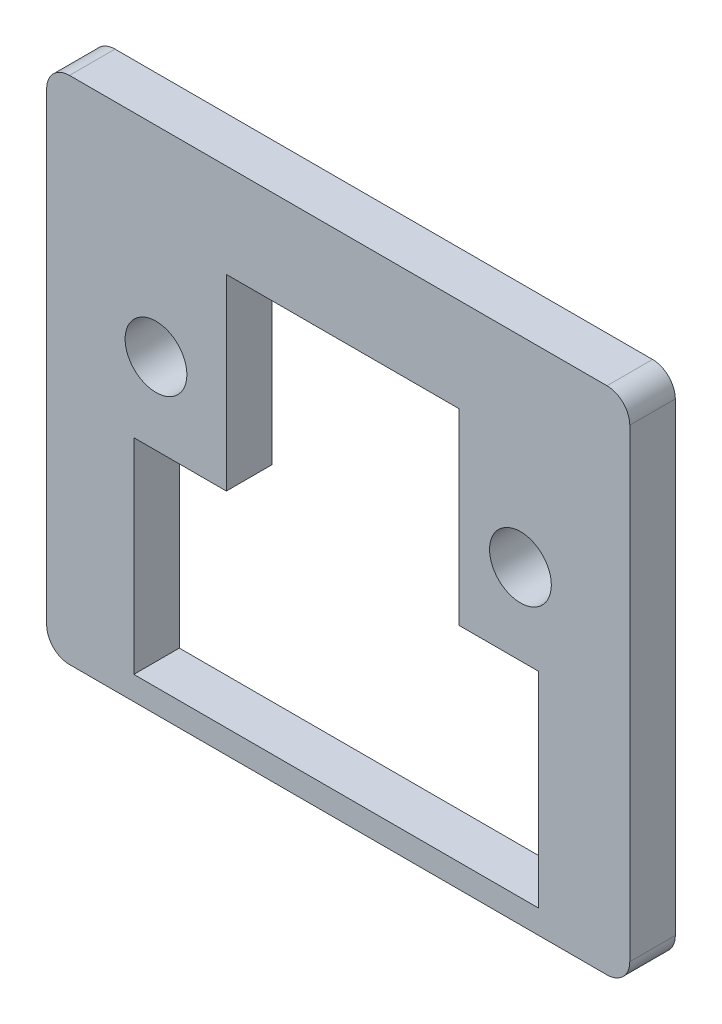
ISO-10303-21;
HEADER;
FILE_DESCRIPTION(('STEP AP214'),'2;1');
FILE_NAME('part.step','',(''),(''),'','','');
FILE_SCHEMA(('AUTOMOTIVE_DESIGN { 1 0 10303 214 1 1 1 1 }'));
ENDSEC;
DATA;
#1=APPLICATION_CONTEXT('core data for automotive mechanical design processes');
#2=APPLICATION_PROTOCOL_DEFINITION('international standard','automotive_design',2000,#1);
#3=PRODUCT_CONTEXT('',#1,'mechanical');
#4=PRODUCT('Part','Part','',(#3));
#5=PRODUCT_RELATED_PRODUCT_CATEGORY('part','',(#4));
#6=PRODUCT_DEFINITION_FORMATION('','',#4);
#7=PRODUCT_DEFINITION_CONTEXT('part definition',#1,'design');
#8=PRODUCT_DEFINITION('design','',#6,#7);
#9=PRODUCT_DEFINITION_SHAPE('','',#8);
#10=(LENGTH_UNIT() NAMED_UNIT(*) SI_UNIT(.MILLI.,.METRE.));
#11=(NAMED_UNIT(*) PLANE_ANGLE_UNIT() SI_UNIT($,.RADIAN.));
#12=(NAMED_UNIT(*) SI_UNIT($,.STERADIAN.) SOLID_ANGLE_UNIT());
#13=UNCERTAINTY_MEASURE_WITH_UNIT(LENGTH_MEASURE(1.E-05),#10,'distance_accuracy_value','');
#14=(GEOMETRIC_REPRESENTATION_CONTEXT(3) GLOBAL_UNCERTAINTY_ASSIGNED_CONTEXT((#13)) GLOBAL_UNIT_ASSIGNED_CONTEXT((#10,
#11,#12)) REPRESENTATION_CONTEXT('',''));
#15=CARTESIAN_POINT('',(0.,0.,0.));
#16=DIRECTION('',(0.,0.,1.));
#17=DIRECTION('',(1.,0.,0.));
#18=AXIS2_PLACEMENT_3D('',#15,#16,#17);
#19=CARTESIAN_POINT('',(-1.58750000000011,1.58749999999956,3.175));
#20=DIRECTION('',(0.,0.,1.));
#21=DIRECTION('',(1.,0.,0.));
#22=AXIS2_PLACEMENT_3D('',#19,#20,#21);
#23=PLANE('',#22);
#24=DIRECTION('',(0.,-1.,0.));
#25=VECTOR('',#24,1.);
#26=CARTESIAN_POINT('',(-11.9185627495797,29.0180049818764,3.175));
#27=LINE('',#26,#25);
#28=CARTESIAN_POINT('',(-11.9185627495797,29.0180049818764,3.175));
#29=VERTEX_POINT('',#28);
#30=CARTESIAN_POINT('',(-11.9185627495797,15.9394789528714,3.175));
#31=VERTEX_POINT('',#30);
#32=EDGE_CURVE('E148',#29,#31,#27,.T.);
#33=ORIENTED_EDGE('',*,*,#32,.T.);
#34=DIRECTION('',(1.,0.,0.));
#35=VECTOR('',#34,1.);
#36=CARTESIAN_POINT('',(-11.9185627495797,15.9394789528714,3.175));
#37=LINE('',#36,#35);
#38=CARTESIAN_POINT('',(-6.3753464194054,15.9394789528714,3.175));
#39=VERTEX_POINT('',#38);
#40=EDGE_CURVE('E157',#31,#39,#37,.T.);
#41=ORIENTED_EDGE('',*,*,#40,.T.);
#42=DIRECTION('',(0.,-1.,0.));
#43=VECTOR('',#42,1.);
#44=CARTESIAN_POINT('',(-6.3753464194054,15.9394789528714,3.175));
#45=LINE('',#44,#43);
#46=CARTESIAN_POINT('',(-6.3753464194054,1.64837435164083,3.175));
#47=VERTEX_POINT('',#46);
#48=EDGE_CURVE('E48',#39,#47,#45,.T.);
#49=ORIENTED_EDGE('',*,*,#48,.T.);
#50=DIRECTION('',(-1.,0.,0.));
#51=VECTOR('',#50,1.);
#52=CARTESIAN_POINT('',(-6.3753464194054,1.64837435164083,3.175));
#53=LINE('',#52,#51);
#54=CARTESIAN_POINT('',(-34.5677982236512,1.64837435164083,3.175));
#55=VERTEX_POINT('',#54);
#56=EDGE_CURVE('E170',#47,#55,#53,.T.);
#57=ORIENTED_EDGE('',*,*,#56,.T.);
#58=DIRECTION('',(0.,1.,0.));
#59=VECTOR('',#58,1.);
#60=CARTESIAN_POINT('',(-34.5677982236512,1.64837435164083,3.175));
#61=LINE('',#60,#59);
#62=CARTESIAN_POINT('',(-34.5677982236512,15.9394789528714,3.175));
#63=VERTEX_POINT('',#62);
#64=EDGE_CURVE('E173',#55,#63,#61,.T.);
#65=ORIENTED_EDGE('',*,*,#64,.T.);
#66=DIRECTION('',(1.,0.,0.));
#67=VECTOR('',#66,1.);
#68=CARTESIAN_POINT('',(-34.5677982236512,15.9394789528714,3.175));
#69=LINE('',#68,#67);
#70=CARTESIAN_POINT('',(-28.1151479643077,15.9394789528714,3.175));
#71=VERTEX_POINT('',#70);
#72=EDGE_CURVE('E176',#63,#71,#69,.T.);
#73=ORIENTED_EDGE('',*,*,#72,.T.);
#74=DIRECTION('',(0.,-1.,0.));
#75=VECTOR('',#74,1.);
#76=CARTESIAN_POINT('',(-28.1151479643077,29.0180049818764,3.175));
#77=LINE('',#76,#75);
#78=CARTESIAN_POINT('',(-28.1151479643077,29.0180049818764,3.175));
#79=VERTEX_POINT('',#78);
#80=EDGE_CURVE('E179',#79,#71,#77,.T.);
#81=ORIENTED_EDGE('',*,*,#80,.F.);
#82=DIRECTION('',(-1.,0.,0.));
#83=VECTOR('',#82,1.);
#84=CARTESIAN_POINT('',(-11.9185627495797,29.0180049818764,3.175));
#85=LINE('',#84,#83);
#86=EDGE_CURVE('E154',#29,#79,#85,.T.);
#87=ORIENTED_EDGE('',*,*,#86,.F.);
#88=EDGE_LOOP('',(#33,#41,#49,#57,#65,#73,#81,#87));
#89=FACE_BOUND('',#88,.T.);
#90=CARTESIAN_POINT('',(-7.62000000000011,21.5899999999996,3.175));
#91=DIRECTION('',(0.,0.,1.));
#92=DIRECTION('',(1.,0.,0.));
#93=AXIS2_PLACEMENT_3D('',#90,#91,#92);
#94=CIRCLE('',#93,2.15265);
#95=CARTESIAN_POINT('',(-5.46735000000011,21.5899999999996,3.175));
#96=VERTEX_POINT('',#95);
#97=EDGE_CURVE('E219',#96,#96,#94,.T.);
#98=ORIENTED_EDGE('',*,*,#97,.F.);
#99=EDGE_LOOP('',(#98));
#100=FACE_BOUND('',#99,.T.);
#101=CARTESIAN_POINT('',(-1.58750000000011,1.58749999999956,3.175));
#102=DIRECTION('',(0.,0.,1.));
#103=DIRECTION('',(1.,0.,0.));
#104=AXIS2_PLACEMENT_3D('',#101,#102,#103);
#105=CIRCLE('',#104,1.5875);
#106=CARTESIAN_POINT('',(-1.58750000000011,-4.43872369415566E-13,3.175));
#107=VERTEX_POINT('',#106);
#108=CARTESIAN_POINT('',(-1.10588621593521E-13,1.58749999999956,3.175));
#109=VERTEX_POINT('',#108);
#110=EDGE_CURVE('E225',#107,#109,#105,.T.);
#111=ORIENTED_EDGE('',*,*,#110,.T.);
#112=DIRECTION('',(0.,1.,0.));
#113=VECTOR('',#112,1.);
#114=CARTESIAN_POINT('',(-1.10588621593521E-13,1.58749999999956,3.175));
#115=LINE('',#114,#113);
#116=CARTESIAN_POINT('',(-1.15359111152458E-13,33.9724999999996,3.175));
#117=VERTEX_POINT('',#116);
#118=EDGE_CURVE('E228',#109,#117,#115,.T.);
#119=ORIENTED_EDGE('',*,*,#118,.T.);
#120=CARTESIAN_POINT('',(-1.58750000000011,33.9724999999996,3.175));
#121=DIRECTION('',(0.,0.,1.));
#122=DIRECTION('',(1.,0.,0.));
#123=AXIS2_PLACEMENT_3D('',#120,#121,#122);
#124=CIRCLE('',#123,1.5875);
#125=CARTESIAN_POINT('',(-1.58750000000011,35.5599999999996,3.175));
#126=VERTEX_POINT('',#125);
#127=EDGE_CURVE('E231',#117,#126,#124,.T.);
#128=ORIENTED_EDGE('',*,*,#127,.T.);
#129=DIRECTION('',(-1.,0.,0.));
#130=VECTOR('',#129,1.);
#131=CARTESIAN_POINT('',(-1.58750000000011,35.5599999999996,3.175));
#132=LINE('',#131,#130);
#133=CARTESIAN_POINT('',(-39.0525000000001,35.5599999999995,3.175));
#134=VERTEX_POINT('',#133);
#135=EDGE_CURVE('E233',#126,#134,#132,.T.);
#136=ORIENTED_EDGE('',*,*,#135,.T.);
#137=CARTESIAN_POINT('',(-39.0525000000001,33.9724999999995,3.175));
#138=DIRECTION('',(0.,0.,1.));
#139=DIRECTION('',(1.,0.,0.));
#140=AXIS2_PLACEMENT_3D('',#137,#138,#139);
#141=CIRCLE('',#140,1.5875);
#142=CARTESIAN_POINT('',(-40.6400000000001,33.9724999999995,3.175));
#143=VERTEX_POINT('',#142);
#144=EDGE_CURVE('E235',#134,#143,#141,.T.);
#145=ORIENTED_EDGE('',*,*,#144,.T.);
#146=DIRECTION('',(0.,-1.,0.));
#147=VECTOR('',#146,1.);
#148=CARTESIAN_POINT('',(-40.6400000000001,33.9724999999995,3.175));
#149=LINE('',#148,#147);
#150=CARTESIAN_POINT('',(-40.6400000000001,1.58749999999955,3.175));
#151=VERTEX_POINT('',#150);
#152=EDGE_CURVE('E237',#143,#151,#149,.T.);
#153=ORIENTED_EDGE('',*,*,#152,.T.);
#154=CARTESIAN_POINT('',(-39.0525000000001,1.58749999999955,3.175));
#155=DIRECTION('',(0.,0.,1.));
#156=DIRECTION('',(1.,0.,0.));
#157=AXIS2_PLACEMENT_3D('',#154,#155,#156);
#158=CIRCLE('',#157,1.5875);
#159=CARTESIAN_POINT('',(-39.0525000000001,-4.47341816367519E-13,3.175));
#160=VERTEX_POINT('',#159);
#161=EDGE_CURVE('E239',#151,#160,#158,.T.);
#162=ORIENTED_EDGE('',*,*,#161,.T.);
#163=DIRECTION('',(1.,0.,0.));
#164=VECTOR('',#163,1.);
#165=CARTESIAN_POINT('',(-39.0525000000001,-4.47341816367519E-13,3.175));
#166=LINE('',#165,#164);
#167=EDGE_CURVE('E241',#160,#107,#166,.T.);
#168=ORIENTED_EDGE('',*,*,#167,.T.);
#169=EDGE_LOOP('',(#111,#119,#128,#136,#145,#153,#162,#168));
#170=FACE_BOUND('',#169,.T.);
#171=CARTESIAN_POINT('',(-33.0200000000001,21.5899999999996,3.175));
#172=DIRECTION('',(0.,0.,1.));
#173=DIRECTION('',(1.,0.,0.));
#174=AXIS2_PLACEMENT_3D('',#171,#172,#173);
#175=CIRCLE('',#174,2.15265);
#176=CARTESIAN_POINT('',(-30.8673500000001,21.5899999999996,3.175));
#177=VERTEX_POINT('',#176);
#178=EDGE_CURVE('E213',#177,#177,#175,.T.);
#179=ORIENTED_EDGE('',*,*,#178,.F.);
#180=EDGE_LOOP('',(#179));
#181=FACE_BOUND('',#180,.T.);
#182=ADVANCED_FACE('F33',(#89,#100,#170,#181),#23,.T.);
#183=CARTESIAN_POINT('',(-1.58750000000011,1.58749999999956,0.));
#184=DIRECTION('',(0.,0.,1.));
#185=DIRECTION('',(1.,0.,0.));
#186=AXIS2_PLACEMENT_3D('',#183,#184,#185);
#187=PLANE('',#186);
#188=DIRECTION('',(1.,0.,0.));
#189=VECTOR('',#188,1.);
#190=CARTESIAN_POINT('',(-11.9185627495797,15.9394789528714,0.));
#191=LINE('',#190,#189);
#192=CARTESIAN_POINT('',(-11.9185627495797,15.9394789528714,0.));
#193=VERTEX_POINT('',#192);
#194=CARTESIAN_POINT('',(-6.3753464194054,15.9394789528714,0.));
#195=VERTEX_POINT('',#194);
#196=EDGE_CURVE('E183',#193,#195,#191,.T.);
#197=ORIENTED_EDGE('',*,*,#196,.F.);
#198=DIRECTION('',(0.,-1.,0.));
#199=VECTOR('',#198,1.);
#200=CARTESIAN_POINT('',(-11.9185627495797,29.0180049818764,0.));
#201=LINE('',#200,#199);
#202=CARTESIAN_POINT('',(-11.9185627495797,29.0180049818764,0.));
#203=VERTEX_POINT('',#202);
#204=EDGE_CURVE('E56',#203,#193,#201,.T.);
#205=ORIENTED_EDGE('',*,*,#204,.F.);
#206=DIRECTION('',(-1.,0.,0.));
#207=VECTOR('',#206,1.);
#208=CARTESIAN_POINT('',(-11.9185627495797,29.0180049818764,0.));
#209=LINE('',#208,#207);
#210=CARTESIAN_POINT('',(-28.1151479643077,29.0180049818764,0.));
#211=VERTEX_POINT('',#210);
#212=EDGE_CURVE('E163',#203,#211,#209,.T.);
#213=ORIENTED_EDGE('',*,*,#212,.T.);
#214=DIRECTION('',(0.,-1.,0.));
#215=VECTOR('',#214,1.);
#216=CARTESIAN_POINT('',(-28.1151479643077,29.0180049818764,0.));
#217=LINE('',#216,#215);
#218=CARTESIAN_POINT('',(-28.1151479643077,15.9394789528714,0.));
#219=VERTEX_POINT('',#218);
#220=EDGE_CURVE('E166',#211,#219,#217,.T.);
#221=ORIENTED_EDGE('',*,*,#220,.T.);
#222=DIRECTION('',(1.,0.,0.));
#223=VECTOR('',#222,1.);
#224=CARTESIAN_POINT('',(-34.5677982236512,15.9394789528714,0.));
#225=LINE('',#224,#223);
#226=CARTESIAN_POINT('',(-34.5677982236512,15.9394789528714,0.));
#227=VERTEX_POINT('',#226);
#228=EDGE_CURVE('E194',#227,#219,#225,.T.);
#229=ORIENTED_EDGE('',*,*,#228,.F.);
#230=DIRECTION('',(0.,1.,0.));
#231=VECTOR('',#230,1.);
#232=CARTESIAN_POINT('',(-34.5677982236512,1.64837435164083,0.));
#233=LINE('',#232,#231);
#234=CARTESIAN_POINT('',(-34.5677982236512,1.64837435164083,0.));
#235=VERTEX_POINT('',#234);
#236=EDGE_CURVE('E191',#235,#227,#233,.T.);
#237=ORIENTED_EDGE('',*,*,#236,.F.);
#238=DIRECTION('',(-1.,0.,0.));
#239=VECTOR('',#238,1.);
#240=CARTESIAN_POINT('',(-6.3753464194054,1.64837435164083,0.));
#241=LINE('',#240,#239);
#242=CARTESIAN_POINT('',(-6.3753464194054,1.64837435164083,0.));
#243=VERTEX_POINT('',#242);
#244=EDGE_CURVE('E188',#243,#235,#241,.T.);
#245=ORIENTED_EDGE('',*,*,#244,.F.);
#246=DIRECTION('',(0.,-1.,0.));
#247=VECTOR('',#246,1.);
#248=CARTESIAN_POINT('',(-6.3753464194054,15.9394789528714,0.));
#249=LINE('',#248,#247);
#250=EDGE_CURVE('E185',#195,#243,#249,.T.);
#251=ORIENTED_EDGE('',*,*,#250,.F.);
#252=EDGE_LOOP('',(#197,#205,#213,#221,#229,#237,#245,#251));
#253=FACE_BOUND('',#252,.T.);
#254=CARTESIAN_POINT('',(-1.58750000000011,1.58749999999956,0.));
#255=DIRECTION('',(0.,0.,1.));
#256=DIRECTION('',(1.,0.,0.));
#257=AXIS2_PLACEMENT_3D('',#254,#255,#256);
#258=CIRCLE('',#257,1.5875);
#259=CARTESIAN_POINT('',(-1.58750000000011,-4.43872369415566E-13,0.));
#260=VERTEX_POINT('',#259);
#261=CARTESIAN_POINT('',(-1.10588621593521E-13,1.58749999999956,0.));
#262=VERTEX_POINT('',#261);
#263=EDGE_CURVE('E222',#260,#262,#258,.T.);
#264=ORIENTED_EDGE('',*,*,#263,.F.);
#265=DIRECTION('',(1.,0.,0.));
#266=VECTOR('',#265,1.);
#267=CARTESIAN_POINT('',(-39.0525000000001,-4.47341816367519E-13,0.));
#268=LINE('',#267,#266);
#269=CARTESIAN_POINT('',(-39.0525000000001,-4.47341816367519E-13,0.));
#270=VERTEX_POINT('',#269);
#271=EDGE_CURVE('E229',#270,#260,#268,.T.);
#272=ORIENTED_EDGE('',*,*,#271,.F.);
#273=CARTESIAN_POINT('',(-39.0525000000001,1.58749999999955,0.));
#274=DIRECTION('',(0.,0.,1.));
#275=DIRECTION('',(1.,0.,0.));
#276=AXIS2_PLACEMENT_3D('',#273,#274,#275);
#277=CIRCLE('',#276,1.5875);
#278=CARTESIAN_POINT('',(-40.6400000000001,1.58749999999955,0.));
#279=VERTEX_POINT('',#278);
#280=EDGE_CURVE('E256',#279,#270,#277,.T.);
#281=ORIENTED_EDGE('',*,*,#280,.F.);
#282=DIRECTION('',(0.,-1.,0.));
#283=VECTOR('',#282,1.);
#284=CARTESIAN_POINT('',(-40.6400000000001,33.9724999999995,0.));
#285=LINE('',#284,#283);
#286=CARTESIAN_POINT('',(-40.6400000000001,33.9724999999995,0.));
#287=VERTEX_POINT('',#286);
#288=EDGE_CURVE('E254',#287,#279,#285,.T.);
#289=ORIENTED_EDGE('',*,*,#288,.F.);
#290=CARTESIAN_POINT('',(-39.0525000000001,33.9724999999995,0.));
#291=DIRECTION('',(0.,0.,1.));
#292=DIRECTION('',(1.,0.,0.));
#293=AXIS2_PLACEMENT_3D('',#290,#291,#292);
#294=CIRCLE('',#293,1.5875);
#295=CARTESIAN_POINT('',(-39.0525000000001,35.5599999999995,0.));
#296=VERTEX_POINT('',#295);
#297=EDGE_CURVE('E252',#296,#287,#294,.T.);
#298=ORIENTED_EDGE('',*,*,#297,.F.);
#299=DIRECTION('',(-1.,0.,0.));
#300=VECTOR('',#299,1.);
#301=CARTESIAN_POINT('',(-1.58750000000011,35.5599999999996,0.));
#302=LINE('',#301,#300);
#303=CARTESIAN_POINT('',(-1.58750000000011,35.5599999999996,0.));
#304=VERTEX_POINT('',#303);
#305=EDGE_CURVE('E250',#304,#296,#302,.T.);
#306=ORIENTED_EDGE('',*,*,#305,.F.);
#307=CARTESIAN_POINT('',(-1.58750000000011,33.9724999999996,0.));
#308=DIRECTION('',(0.,0.,1.));
#309=DIRECTION('',(1.,0.,0.));
#310=AXIS2_PLACEMENT_3D('',#307,#308,#309);
#311=CIRCLE('',#310,1.5875);
#312=CARTESIAN_POINT('',(-1.15359111152458E-13,33.9724999999996,0.));
#313=VERTEX_POINT('',#312);
#314=EDGE_CURVE('E248',#313,#304,#311,.T.);
#315=ORIENTED_EDGE('',*,*,#314,.F.);
#316=DIRECTION('',(0.,1.,0.));
#317=VECTOR('',#316,1.);
#318=CARTESIAN_POINT('',(-1.10588621593521E-13,1.58749999999956,0.));
#319=LINE('',#318,#317);
#320=EDGE_CURVE('E246',#262,#313,#319,.T.);
#321=ORIENTED_EDGE('',*,*,#320,.F.);
#322=EDGE_LOOP('',(#264,#272,#281,#289,#298,#306,#315,#321));
#323=FACE_BOUND('',#322,.T.);
#324=CARTESIAN_POINT('',(-7.62000000000011,21.5899999999996,0.));
#325=DIRECTION('',(0.,0.,1.));
#326=DIRECTION('',(1.,0.,0.));
#327=AXIS2_PLACEMENT_3D('',#324,#325,#326);
#328=CIRCLE('',#327,2.15265);
#329=CARTESIAN_POINT('',(-5.46735000000011,21.5899999999996,0.));
#330=VERTEX_POINT('',#329);
#331=EDGE_CURVE('E216',#330,#330,#328,.T.);
#332=ORIENTED_EDGE('',*,*,#331,.T.);
#333=EDGE_LOOP('',(#332));
#334=FACE_BOUND('',#333,.T.);
#335=CARTESIAN_POINT('',(-33.0200000000001,21.5899999999996,0.));
#336=DIRECTION('',(0.,0.,1.));
#337=DIRECTION('',(1.,0.,0.));
#338=AXIS2_PLACEMENT_3D('',#335,#336,#337);
#339=CIRCLE('',#338,2.15265);
#340=CARTESIAN_POINT('',(-30.8673500000001,21.5899999999996,0.));
#341=VERTEX_POINT('',#340);
#342=EDGE_CURVE('E201',#341,#341,#339,.T.);
#343=ORIENTED_EDGE('',*,*,#342,.T.);
#344=EDGE_LOOP('',(#343));
#345=FACE_BOUND('',#344,.T.);
#346=ADVANCED_FACE('F286',(#253,#323,#334,#345),#187,.F.);
#347=CARTESIAN_POINT('',(-1.58750000000011,1.58749999999956,3.175));
#348=DIRECTION('',(0.,0.,-1.));
#349=DIRECTION('',(-1.,0.,0.));
#350=AXIS2_PLACEMENT_3D('',#347,#348,#349);
#351=CYLINDRICAL_SURFACE('',#350,1.5875);
#352=ORIENTED_EDGE('',*,*,#263,.T.);
#353=DIRECTION('',(0.,0.,-1.));
#354=VECTOR('',#353,1.);
#355=CARTESIAN_POINT('',(-1.10588621593521E-13,1.58749999999956,3.175));
#356=LINE('',#355,#354);
#357=EDGE_CURVE('E11',#109,#262,#356,.T.);
#358=ORIENTED_EDGE('',*,*,#357,.F.);
#359=ORIENTED_EDGE('',*,*,#110,.F.);
#360=DIRECTION('',(0.,0.,-1.));
#361=VECTOR('',#360,1.);
#362=CARTESIAN_POINT('',(-1.58750000000011,-4.43872369415566E-13,3.175));
#363=LINE('',#362,#361);
#364=EDGE_CURVE('E243',#107,#260,#363,.T.);
#365=ORIENTED_EDGE('',*,*,#364,.T.);
#366=EDGE_LOOP('',(#352,#358,#359,#365));
#367=FACE_BOUND('',#366,.T.);
#368=ADVANCED_FACE('F35',(#367),#351,.T.);
#369=CARTESIAN_POINT('',(-1.10588621593521E-13,1.58749999999956,3.175));
#370=DIRECTION('',(-1.,0.,0.));
#371=DIRECTION('',(0.,-1.,0.));
#372=AXIS2_PLACEMENT_3D('',#369,#370,#371);
#373=PLANE('',#372);
#374=ORIENTED_EDGE('',*,*,#320,.T.);
#375=DIRECTION('',(0.,0.,-1.));
#376=VECTOR('',#375,1.);
#377=CARTESIAN_POINT('',(-1.15359111152458E-13,33.9724999999996,3.175));
#378=LINE('',#377,#376);
#379=EDGE_CURVE('E41',#117,#313,#378,.T.);
#380=ORIENTED_EDGE('',*,*,#379,.F.);
#381=ORIENTED_EDGE('',*,*,#118,.F.);
#382=ORIENTED_EDGE('',*,*,#357,.T.);
#383=EDGE_LOOP('',(#374,#380,#381,#382));
#384=FACE_BOUND('',#383,.T.);
#385=ADVANCED_FACE('F304',(#384),#373,.F.);
#386=CARTESIAN_POINT('',(-1.58750000000011,33.9724999999996,3.175));
#387=DIRECTION('',(0.,0.,-1.));
#388=DIRECTION('',(-1.,0.,0.));
#389=AXIS2_PLACEMENT_3D('',#386,#387,#388);
#390=CYLINDRICAL_SURFACE('',#389,1.5875);
#391=ORIENTED_EDGE('',*,*,#314,.T.);
#392=DIRECTION('',(0.,0.,-1.));
#393=VECTOR('',#392,1.);
#394=CARTESIAN_POINT('',(-1.58750000000011,35.5599999999996,3.175));
#395=LINE('',#394,#393);
#396=EDGE_CURVE('E273',#126,#304,#395,.T.);
#397=ORIENTED_EDGE('',*,*,#396,.F.);
#398=ORIENTED_EDGE('',*,*,#127,.F.);
#399=ORIENTED_EDGE('',*,*,#379,.T.);
#400=EDGE_LOOP('',(#391,#397,#398,#399));
#401=FACE_BOUND('',#400,.T.);
#402=ADVANCED_FACE('F280',(#401),#390,.T.);
#403=CARTESIAN_POINT('',(-1.58750000000011,35.5599999999996,3.175));
#404=DIRECTION('',(0.,-1.,0.));
#405=DIRECTION('',(1.,0.,0.));
#406=AXIS2_PLACEMENT_3D('',#403,#404,#405);
#407=PLANE('',#406);
#408=ORIENTED_EDGE('',*,*,#305,.T.);
#409=DIRECTION('',(0.,0.,-1.));
#410=VECTOR('',#409,1.);
#411=CARTESIAN_POINT('',(-39.0525000000001,35.5599999999995,3.175));
#412=LINE('',#411,#410);
#413=EDGE_CURVE('E270',#134,#296,#412,.T.);
#414=ORIENTED_EDGE('',*,*,#413,.F.);
#415=ORIENTED_EDGE('',*,*,#135,.F.);
#416=ORIENTED_EDGE('',*,*,#396,.T.);
#417=EDGE_LOOP('',(#408,#414,#415,#416));
#418=FACE_BOUND('',#417,.T.);
#419=ADVANCED_FACE('F292',(#418),#407,.F.);
#420=CARTESIAN_POINT('',(-39.0525000000001,33.9724999999995,3.175));
#421=DIRECTION('',(0.,0.,-1.));
#422=DIRECTION('',(-1.,0.,0.));
#423=AXIS2_PLACEMENT_3D('',#420,#421,#422);
#424=CYLINDRICAL_SURFACE('',#423,1.5875);
#425=ORIENTED_EDGE('',*,*,#297,.T.);
#426=DIRECTION('',(0.,0.,-1.));
#427=VECTOR('',#426,1.);
#428=CARTESIAN_POINT('',(-40.6400000000001,33.9724999999995,3.175));
#429=LINE('',#428,#427);
#430=EDGE_CURVE('E267',#143,#287,#429,.T.);
#431=ORIENTED_EDGE('',*,*,#430,.F.);
#432=ORIENTED_EDGE('',*,*,#144,.F.);
#433=ORIENTED_EDGE('',*,*,#413,.T.);
#434=EDGE_LOOP('',(#425,#431,#432,#433));
#435=FACE_BOUND('',#434,.T.);
#436=ADVANCED_FACE('F296',(#435),#424,.T.);
#437=CARTESIAN_POINT('',(-40.6400000000001,33.9724999999995,3.175));
#438=DIRECTION('',(1.,0.,0.));
#439=DIRECTION('',(0.,1.,0.));
#440=AXIS2_PLACEMENT_3D('',#437,#438,#439);
#441=PLANE('',#440);
#442=ORIENTED_EDGE('',*,*,#288,.T.);
#443=DIRECTION('',(0.,0.,-1.));
#444=VECTOR('',#443,1.);
#445=CARTESIAN_POINT('',(-40.6400000000001,1.58749999999955,3.175));
#446=LINE('',#445,#444);
#447=EDGE_CURVE('E264',#151,#279,#446,.T.);
#448=ORIENTED_EDGE('',*,*,#447,.F.);
#449=ORIENTED_EDGE('',*,*,#152,.F.);
#450=ORIENTED_EDGE('',*,*,#430,.T.);
#451=EDGE_LOOP('',(#442,#448,#449,#450));
#452=FACE_BOUND('',#451,.T.);
#453=ADVANCED_FACE('F317',(#452),#441,.F.);
#454=CARTESIAN_POINT('',(-39.0525000000001,1.58749999999955,3.175));
#455=DIRECTION('',(0.,0.,-1.));
#456=DIRECTION('',(-1.,0.,0.));
#457=AXIS2_PLACEMENT_3D('',#454,#455,#456);
#458=CYLINDRICAL_SURFACE('',#457,1.5875);
#459=ORIENTED_EDGE('',*,*,#280,.T.);
#460=DIRECTION('',(0.,0.,-1.));
#461=VECTOR('',#460,1.);
#462=CARTESIAN_POINT('',(-39.0525000000001,-4.47341816367519E-13,3.175));
#463=LINE('',#462,#461);
#464=EDGE_CURVE('E261',#160,#270,#463,.T.);
#465=ORIENTED_EDGE('',*,*,#464,.F.);
#466=ORIENTED_EDGE('',*,*,#161,.F.);
#467=ORIENTED_EDGE('',*,*,#447,.T.);
#468=EDGE_LOOP('',(#459,#465,#466,#467));
#469=FACE_BOUND('',#468,.T.);
#470=ADVANCED_FACE('F315',(#469),#458,.T.);
#471=CARTESIAN_POINT('',(-39.0525000000001,-4.47341816367519E-13,3.175));
#472=DIRECTION('',(0.,1.,0.));
#473=DIRECTION('',(-1.,0.,0.));
#474=AXIS2_PLACEMENT_3D('',#471,#472,#473);
#475=PLANE('',#474);
#476=ORIENTED_EDGE('',*,*,#271,.T.);
#477=ORIENTED_EDGE('',*,*,#364,.F.);
#478=ORIENTED_EDGE('',*,*,#167,.F.);
#479=ORIENTED_EDGE('',*,*,#464,.T.);
#480=EDGE_LOOP('',(#476,#477,#478,#479));
#481=FACE_BOUND('',#480,.T.);
#482=ADVANCED_FACE('F310',(#481),#475,.F.);
#483=CARTESIAN_POINT('',(-7.62000000000011,21.5899999999996,3.175));
#484=DIRECTION('',(0.,0.,-1.));
#485=DIRECTION('',(-1.,0.,0.));
#486=AXIS2_PLACEMENT_3D('',#483,#484,#485);
#487=CYLINDRICAL_SURFACE('',#486,2.15265);
#488=ORIENTED_EDGE('',*,*,#97,.T.);
#489=EDGE_LOOP('',(#488));
#490=FACE_BOUND('',#489,.T.);
#491=ORIENTED_EDGE('',*,*,#331,.F.);
#492=EDGE_LOOP('',(#491));
#493=FACE_BOUND('',#492,.T.);
#494=ADVANCED_FACE('F335',(#490,#493),#487,.F.);
#495=CARTESIAN_POINT('',(-33.0200000000001,21.5899999999996,3.175));
#496=DIRECTION('',(0.,0.,-1.));
#497=DIRECTION('',(-1.,0.,0.));
#498=AXIS2_PLACEMENT_3D('',#495,#496,#497);
#499=CYLINDRICAL_SURFACE('',#498,2.15265);
#500=ORIENTED_EDGE('',*,*,#178,.T.);
#501=EDGE_LOOP('',(#500));
#502=FACE_BOUND('',#501,.T.);
#503=ORIENTED_EDGE('',*,*,#342,.F.);
#504=EDGE_LOOP('',(#503));
#505=FACE_BOUND('',#504,.T.);
#506=ADVANCED_FACE('F342',(#502,#505),#499,.F.);
#507=CARTESIAN_POINT('',(-11.9185627495797,29.0180049818764,3.175));
#508=DIRECTION('',(1.,0.,0.));
#509=DIRECTION('',(0.,0.,-1.));
#510=AXIS2_PLACEMENT_3D('',#507,#508,#509);
#511=PLANE('',#510);
#512=ORIENTED_EDGE('',*,*,#204,.T.);
#513=DIRECTION('',(0.,0.,-1.));
#514=VECTOR('',#513,1.);
#515=CARTESIAN_POINT('',(-11.9185627495797,15.9394789528714,3.175));
#516=LINE('',#515,#514);
#517=EDGE_CURVE('E144',#31,#193,#516,.T.);
#518=ORIENTED_EDGE('',*,*,#517,.F.);
#519=ORIENTED_EDGE('',*,*,#32,.F.);
#520=DIRECTION('',(0.,0.,-1.));
#521=VECTOR('',#520,1.);
#522=CARTESIAN_POINT('',(-11.9185627495797,29.0180049818764,3.175));
#523=LINE('',#522,#521);
#524=EDGE_CURVE('E199',#29,#203,#523,.T.);
#525=ORIENTED_EDGE('',*,*,#524,.T.);
#526=EDGE_LOOP('',(#512,#518,#519,#525));
#527=FACE_BOUND('',#526,.T.);
#528=ADVANCED_FACE('F146',(#527),#511,.F.);
#529=CARTESIAN_POINT('',(-11.9185627495797,29.0180049818764,3.175));
#530=DIRECTION('',(0.,-1.,0.));
#531=DIRECTION('',(0.,0.,-1.));
#532=AXIS2_PLACEMENT_3D('',#529,#530,#531);
#533=PLANE('',#532);
#534=ORIENTED_EDGE('',*,*,#212,.F.);
#535=ORIENTED_EDGE('',*,*,#524,.F.);
#536=ORIENTED_EDGE('',*,*,#86,.T.);
#537=DIRECTION('',(0.,0.,-1.));
#538=VECTOR('',#537,1.);
#539=CARTESIAN_POINT('',(-28.1151479643077,29.0180049818764,3.175));
#540=LINE('',#539,#538);
#541=EDGE_CURVE('E202',#79,#211,#540,.T.);
#542=ORIENTED_EDGE('',*,*,#541,.T.);
#543=EDGE_LOOP('',(#534,#535,#536,#542));
#544=FACE_BOUND('',#543,.T.);
#545=ADVANCED_FACE('F356',(#544),#533,.T.);
#546=CARTESIAN_POINT('',(-28.1151479643077,29.0180049818764,3.175));
#547=DIRECTION('',(1.,0.,0.));
#548=DIRECTION('',(0.,0.,-1.));
#549=AXIS2_PLACEMENT_3D('',#546,#547,#548);
#550=PLANE('',#549);
#551=ORIENTED_EDGE('',*,*,#220,.F.);
#552=ORIENTED_EDGE('',*,*,#541,.F.);
#553=ORIENTED_EDGE('',*,*,#80,.T.);
#554=DIRECTION('',(0.,0.,-1.));
#555=VECTOR('',#554,1.);
#556=CARTESIAN_POINT('',(-28.1151479643077,15.9394789528714,3.175));
#557=LINE('',#556,#555);
#558=EDGE_CURVE('E204',#71,#219,#557,.T.);
#559=ORIENTED_EDGE('',*,*,#558,.T.);
#560=EDGE_LOOP('',(#551,#552,#553,#559));
#561=FACE_BOUND('',#560,.T.);
#562=ADVANCED_FACE('F375',(#561),#550,.T.);
#563=CARTESIAN_POINT('',(-34.5677982236512,15.9394789528714,3.175));
#564=DIRECTION('',(0.,1.,0.));
#565=DIRECTION('',(0.,0.,1.));
#566=AXIS2_PLACEMENT_3D('',#563,#564,#565);
#567=PLANE('',#566);
#568=ORIENTED_EDGE('',*,*,#228,.T.);
#569=ORIENTED_EDGE('',*,*,#558,.F.);
#570=ORIENTED_EDGE('',*,*,#72,.F.);
#571=DIRECTION('',(0.,0.,-1.));
#572=VECTOR('',#571,1.);
#573=CARTESIAN_POINT('',(-34.5677982236512,15.9394789528714,3.175));
#574=LINE('',#573,#572);
#575=EDGE_CURVE('E206',#63,#227,#574,.T.);
#576=ORIENTED_EDGE('',*,*,#575,.T.);
#577=EDGE_LOOP('',(#568,#569,#570,#576));
#578=FACE_BOUND('',#577,.T.);
#579=ADVANCED_FACE('F371',(#578),#567,.F.);
#580=CARTESIAN_POINT('',(-34.5677982236512,1.64837435164083,3.175));
#581=DIRECTION('',(-1.,0.,0.));
#582=DIRECTION('',(0.,0.,1.));
#583=AXIS2_PLACEMENT_3D('',#580,#581,#582);
#584=PLANE('',#583);
#585=ORIENTED_EDGE('',*,*,#236,.T.);
#586=ORIENTED_EDGE('',*,*,#575,.F.);
#587=ORIENTED_EDGE('',*,*,#64,.F.);
#588=DIRECTION('',(0.,0.,-1.));
#589=VECTOR('',#588,1.);
#590=CARTESIAN_POINT('',(-34.5677982236512,1.64837435164083,3.175));
#591=LINE('',#590,#589);
#592=EDGE_CURVE('E208',#55,#235,#591,.T.);
#593=ORIENTED_EDGE('',*,*,#592,.T.);
#594=EDGE_LOOP('',(#585,#586,#587,#593));
#595=FACE_BOUND('',#594,.T.);
#596=ADVANCED_FACE('F367',(#595),#584,.F.);
#597=CARTESIAN_POINT('',(-6.3753464194054,1.64837435164083,3.175));
#598=DIRECTION('',(0.,-1.,0.));
#599=DIRECTION('',(0.,0.,-1.));
#600=AXIS2_PLACEMENT_3D('',#597,#598,#599);
#601=PLANE('',#600);
#602=ORIENTED_EDGE('',*,*,#244,.T.);
#603=ORIENTED_EDGE('',*,*,#592,.F.);
#604=ORIENTED_EDGE('',*,*,#56,.F.);
#605=DIRECTION('',(0.,0.,-1.));
#606=VECTOR('',#605,1.);
#607=CARTESIAN_POINT('',(-6.3753464194054,1.64837435164083,3.175));
#608=LINE('',#607,#606);
#609=EDGE_CURVE('E210',#47,#243,#608,.T.);
#610=ORIENTED_EDGE('',*,*,#609,.T.);
#611=EDGE_LOOP('',(#602,#603,#604,#610));
#612=FACE_BOUND('',#611,.T.);
#613=ADVANCED_FACE('F364',(#612),#601,.F.);
#614=CARTESIAN_POINT('',(-6.3753464194054,15.9394789528714,3.175));
#615=DIRECTION('',(1.,0.,0.));
#616=DIRECTION('',(0.,0.,-1.));
#617=AXIS2_PLACEMENT_3D('',#614,#615,#616);
#618=PLANE('',#617);
#619=ORIENTED_EDGE('',*,*,#250,.T.);
#620=ORIENTED_EDGE('',*,*,#609,.F.);
#621=ORIENTED_EDGE('',*,*,#48,.F.);
#622=DIRECTION('',(0.,0.,-1.));
#623=VECTOR('',#622,1.);
#624=CARTESIAN_POINT('',(-6.3753464194054,15.9394789528714,3.175));
#625=LINE('',#624,#623);
#626=EDGE_CURVE('E153',#39,#195,#625,.T.);
#627=ORIENTED_EDGE('',*,*,#626,.T.);
#628=EDGE_LOOP('',(#619,#620,#621,#627));
#629=FACE_BOUND('',#628,.T.);
#630=ADVANCED_FACE('F361',(#629),#618,.F.);
#631=CARTESIAN_POINT('',(-11.9185627495797,15.9394789528714,3.175));
#632=DIRECTION('',(0.,1.,0.));
#633=DIRECTION('',(0.,0.,1.));
#634=AXIS2_PLACEMENT_3D('',#631,#632,#633);
#635=PLANE('',#634);
#636=ORIENTED_EDGE('',*,*,#196,.T.);
#637=ORIENTED_EDGE('',*,*,#626,.F.);
#638=ORIENTED_EDGE('',*,*,#40,.F.);
#639=ORIENTED_EDGE('',*,*,#517,.T.);
#640=EDGE_LOOP('',(#636,#637,#638,#639));
#641=FACE_BOUND('',#640,.T.);
#642=ADVANCED_FACE('F158',(#641),#635,.F.);
#643=CLOSED_SHELL('',(#182,#346,#368,#385,#402,#419,#436,#453,#470,#482,#494,#506,#528,#545,
#562,#579,#596,#613,#630,#642));
#644=MANIFOLD_SOLID_BREP('B2',#643);
#645=ADVANCED_BREP_SHAPE_REPRESENTATION('',(#18,#644),#14);
#646=SHAPE_DEFINITION_REPRESENTATION(#9,#645);
ENDSEC;
END-ISO-10303-21;
